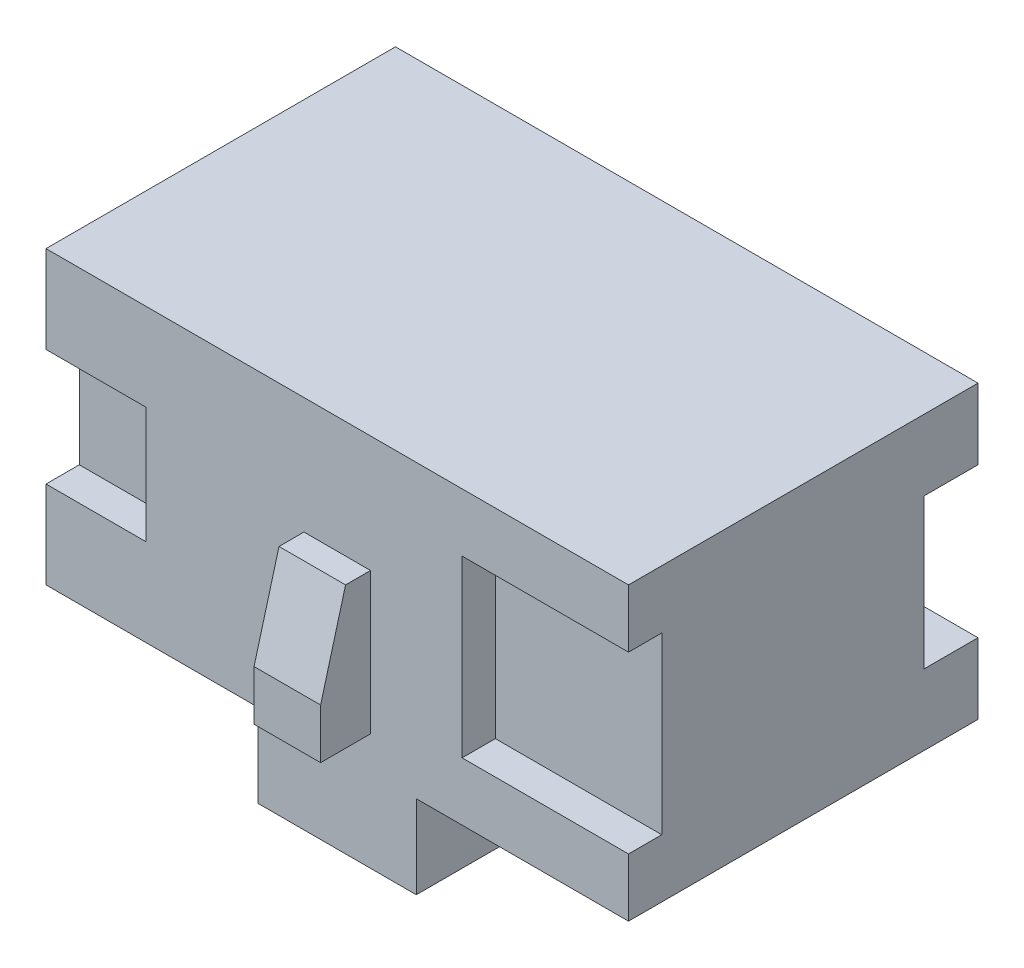
ISO-10303-21;
HEADER;
FILE_DESCRIPTION(('STEP AP214'),'2;1');
FILE_NAME('part.step','',(''),(''),'','','');
FILE_SCHEMA(('AUTOMOTIVE_DESIGN { 1 0 10303 214 1 1 1 1 }'));
ENDSEC;
DATA;
#1=APPLICATION_CONTEXT('core data for automotive mechanical design processes');
#2=APPLICATION_PROTOCOL_DEFINITION('international standard','automotive_design',2000,#1);
#3=PRODUCT_CONTEXT('',#1,'mechanical');
#4=PRODUCT('Part','Part','',(#3));
#5=PRODUCT_RELATED_PRODUCT_CATEGORY('part','',(#4));
#6=PRODUCT_DEFINITION_FORMATION('','',#4);
#7=PRODUCT_DEFINITION_CONTEXT('part definition',#1,'design');
#8=PRODUCT_DEFINITION('design','',#6,#7);
#9=PRODUCT_DEFINITION_SHAPE('','',#8);
#10=(LENGTH_UNIT() NAMED_UNIT(*) SI_UNIT(.MILLI.,.METRE.));
#11=(NAMED_UNIT(*) PLANE_ANGLE_UNIT() SI_UNIT($,.RADIAN.));
#12=(NAMED_UNIT(*) SI_UNIT($,.STERADIAN.) SOLID_ANGLE_UNIT());
#13=UNCERTAINTY_MEASURE_WITH_UNIT(LENGTH_MEASURE(1.E-05),#10,'distance_accuracy_value','');
#14=(GEOMETRIC_REPRESENTATION_CONTEXT(3) GLOBAL_UNCERTAINTY_ASSIGNED_CONTEXT((#13)) GLOBAL_UNIT_ASSIGNED_CONTEXT((#10,
#11,#12)) REPRESENTATION_CONTEXT('',''));
#15=CARTESIAN_POINT('',(0.,0.,0.));
#16=DIRECTION('',(0.,0.,1.));
#17=DIRECTION('',(1.,0.,0.));
#18=AXIS2_PLACEMENT_3D('',#15,#16,#17);
#19=CARTESIAN_POINT('',(0.,0.,42.));
#20=DIRECTION('',(0.,0.,1.));
#21=DIRECTION('',(1.,0.,0.));
#22=AXIS2_PLACEMENT_3D('',#19,#20,#21);
#23=PLANE('',#22);
#24=DIRECTION('',(-1.,0.,0.));
#25=VECTOR('',#24,1.);
#26=CARTESIAN_POINT('',(-23.,7.,42.));
#27=LINE('',#26,#25);
#28=CARTESIAN_POINT('',(-23.,7.,42.));
#29=VERTEX_POINT('',#28);
#30=CARTESIAN_POINT('',(-35.,7.,42.));
#31=VERTEX_POINT('',#30);
#32=EDGE_CURVE('E251',#29,#31,#27,.T.);
#33=ORIENTED_EDGE('',*,*,#32,.F.);
#34=DIRECTION('',(0.,1.,0.));
#35=VECTOR('',#34,1.);
#36=CARTESIAN_POINT('',(-23.,-7.,42.));
#37=LINE('',#36,#35);
#38=CARTESIAN_POINT('',(-23.,-7.,42.));
#39=VERTEX_POINT('',#38);
#40=EDGE_CURVE('E263',#39,#29,#37,.T.);
#41=ORIENTED_EDGE('',*,*,#40,.F.);
#42=DIRECTION('',(1.,0.,0.));
#43=VECTOR('',#42,1.);
#44=CARTESIAN_POINT('',(-23.,-7.,42.));
#45=LINE('',#44,#43);
#46=CARTESIAN_POINT('',(-35.,-7.,42.));
#47=VERTEX_POINT('',#46);
#48=EDGE_CURVE('E242',#47,#39,#45,.T.);
#49=ORIENTED_EDGE('',*,*,#48,.F.);
#50=DIRECTION('',(0.,1.,0.));
#51=VECTOR('',#50,1.);
#52=CARTESIAN_POINT('',(-35.,0.,42.));
#53=LINE('',#52,#51);
#54=CARTESIAN_POINT('',(-35.,-17.5,42.));
#55=VERTEX_POINT('',#54);
#56=EDGE_CURVE('E347',#55,#47,#53,.T.);
#57=ORIENTED_EDGE('',*,*,#56,.F.);
#58=DIRECTION('',(1.,0.,0.));
#59=VECTOR('',#58,1.);
#60=CARTESIAN_POINT('',(0.,-17.5,42.));
#61=LINE('',#60,#59);
#62=CARTESIAN_POINT('',(-9.5,-17.5,42.));
#63=VERTEX_POINT('',#62);
#64=EDGE_CURVE('E339',#55,#63,#61,.T.);
#65=ORIENTED_EDGE('',*,*,#64,.T.);
#66=DIRECTION('',(0.,1.,0.));
#67=VECTOR('',#66,1.);
#68=CARTESIAN_POINT('',(-9.5,0.,42.));
#69=LINE('',#68,#67);
#70=CARTESIAN_POINT('',(-9.5,-27.5,42.));
#71=VERTEX_POINT('',#70);
#72=EDGE_CURVE('E350',#71,#63,#69,.T.);
#73=ORIENTED_EDGE('',*,*,#72,.F.);
#74=DIRECTION('',(1.,0.,0.));
#75=VECTOR('',#74,1.);
#76=CARTESIAN_POINT('',(0.,-27.5,42.));
#77=LINE('',#76,#75);
#78=CARTESIAN_POINT('',(9.5,-27.5,42.));
#79=VERTEX_POINT('',#78);
#80=EDGE_CURVE('E330',#71,#79,#77,.T.);
#81=ORIENTED_EDGE('',*,*,#80,.T.);
#82=DIRECTION('',(0.,1.,0.));
#83=VECTOR('',#82,1.);
#84=CARTESIAN_POINT('',(9.5,0.,42.));
#85=LINE('',#84,#83);
#86=CARTESIAN_POINT('',(9.5,-17.5,42.));
#87=VERTEX_POINT('',#86);
#88=EDGE_CURVE('E333',#79,#87,#85,.T.);
#89=ORIENTED_EDGE('',*,*,#88,.T.);
#90=CARTESIAN_POINT('',(35.,-17.5,42.));
#91=VERTEX_POINT('',#90);
#92=EDGE_CURVE('E336',#87,#91,#61,.T.);
#93=ORIENTED_EDGE('',*,*,#92,.T.);
#94=DIRECTION('',(0.,1.,0.));
#95=VECTOR('',#94,1.);
#96=CARTESIAN_POINT('',(35.,0.,42.));
#97=LINE('',#96,#95);
#98=CARTESIAN_POINT('',(35.,-10.5,42.));
#99=VERTEX_POINT('',#98);
#100=EDGE_CURVE('E340',#91,#99,#97,.T.);
#101=ORIENTED_EDGE('',*,*,#100,.T.);
#102=DIRECTION('',(1.,0.,0.));
#103=VECTOR('',#102,1.);
#104=CARTESIAN_POINT('',(35.,-10.5,42.));
#105=LINE('',#104,#103);
#106=CARTESIAN_POINT('',(15.,-10.5,42.));
#107=VERTEX_POINT('',#106);
#108=EDGE_CURVE('E290',#107,#99,#105,.T.);
#109=ORIENTED_EDGE('',*,*,#108,.F.);
#110=DIRECTION('',(0.,-1.,0.));
#111=VECTOR('',#110,1.);
#112=CARTESIAN_POINT('',(15.,-10.5,42.));
#113=LINE('',#112,#111);
#114=CARTESIAN_POINT('',(15.,10.5,42.));
#115=VERTEX_POINT('',#114);
#116=EDGE_CURVE('E270',#115,#107,#113,.T.);
#117=ORIENTED_EDGE('',*,*,#116,.F.);
#118=DIRECTION('',(-1.,0.,0.));
#119=VECTOR('',#118,1.);
#120=CARTESIAN_POINT('',(35.,10.5,42.));
#121=LINE('',#120,#119);
#122=CARTESIAN_POINT('',(35.,10.5,42.));
#123=VERTEX_POINT('',#122);
#124=EDGE_CURVE('E280',#123,#115,#121,.T.);
#125=ORIENTED_EDGE('',*,*,#124,.F.);
#126=CARTESIAN_POINT('',(35.,17.5,42.));
#127=VERTEX_POINT('',#126);
#128=EDGE_CURVE('E338',#123,#127,#97,.T.);
#129=ORIENTED_EDGE('',*,*,#128,.T.);
#130=DIRECTION('',(1.,0.,0.));
#131=VECTOR('',#130,1.);
#132=CARTESIAN_POINT('',(0.,17.5,42.));
#133=LINE('',#132,#131);
#134=CARTESIAN_POINT('',(-35.,17.5,42.));
#135=VERTEX_POINT('',#134);
#136=EDGE_CURVE('E343',#135,#127,#133,.T.);
#137=ORIENTED_EDGE('',*,*,#136,.F.);
#138=EDGE_CURVE('E346',#31,#135,#53,.T.);
#139=ORIENTED_EDGE('',*,*,#138,.F.);
#140=EDGE_LOOP('',(#33,#41,#49,#57,#65,#73,#81,#89,#93,#101,#109,#117,#125,#129,#137,#139));
#141=FACE_BOUND('',#140,.T.);
#142=DIRECTION('',(1.,0.,0.));
#143=VECTOR('',#142,1.);
#144=CARTESIAN_POINT('',(-4.,-13.5,42.));
#145=LINE('',#144,#143);
#146=CARTESIAN_POINT('',(-4.,-13.5,42.));
#147=VERTEX_POINT('',#146);
#148=CARTESIAN_POINT('',(4.,-13.5,42.));
#149=VERTEX_POINT('',#148);
#150=EDGE_CURVE('E54',#147,#149,#145,.T.);
#151=ORIENTED_EDGE('',*,*,#150,.F.);
#152=DIRECTION('',(0.,1.,0.));
#153=VECTOR('',#152,1.);
#154=CARTESIAN_POINT('',(-4.,0.,42.));
#155=LINE('',#154,#153);
#156=CARTESIAN_POINT('',(-4.,3.5,42.));
#157=VERTEX_POINT('',#156);
#158=EDGE_CURVE('E49',#147,#157,#155,.T.);
#159=ORIENTED_EDGE('',*,*,#158,.T.);
#160=DIRECTION('',(1.,0.,0.));
#161=VECTOR('',#160,1.);
#162=CARTESIAN_POINT('',(-4.,3.5,42.));
#163=LINE('',#162,#161);
#164=CARTESIAN_POINT('',(4.,3.5,42.));
#165=VERTEX_POINT('',#164);
#166=EDGE_CURVE('E240',#157,#165,#163,.T.);
#167=ORIENTED_EDGE('',*,*,#166,.T.);
#168=DIRECTION('',(0.,1.,0.));
#169=VECTOR('',#168,1.);
#170=CARTESIAN_POINT('',(4.,0.,42.));
#171=LINE('',#170,#169);
#172=EDGE_CURVE('E224',#149,#165,#171,.T.);
#173=ORIENTED_EDGE('',*,*,#172,.F.);
#174=EDGE_LOOP('',(#151,#159,#167,#173));
#175=FACE_BOUND('',#174,.T.);
#176=ADVANCED_FACE('F34',(#141,#175),#23,.T.);
#177=CARTESIAN_POINT('',(0.,0.,0.));
#178=DIRECTION('',(0.,0.,1.));
#179=DIRECTION('',(1.,0.,0.));
#180=AXIS2_PLACEMENT_3D('',#177,#178,#179);
#181=PLANE('',#180);
#182=DIRECTION('',(0.,1.,0.));
#183=VECTOR('',#182,1.);
#184=CARTESIAN_POINT('',(-35.,0.,0.));
#185=LINE('',#184,#183);
#186=CARTESIAN_POINT('',(-35.,-17.5,0.));
#187=VERTEX_POINT('',#186);
#188=CARTESIAN_POINT('',(-35.,-9.,0.));
#189=VERTEX_POINT('',#188);
#190=EDGE_CURVE('E369',#187,#189,#185,.T.);
#191=ORIENTED_EDGE('',*,*,#190,.T.);
#192=DIRECTION('',(1.,0.,0.));
#193=VECTOR('',#192,1.);
#194=CARTESIAN_POINT('',(-35.,-9.,0.));
#195=LINE('',#194,#193);
#196=CARTESIAN_POINT('',(35.,-9.,0.));
#197=VERTEX_POINT('',#196);
#198=EDGE_CURVE('E314',#189,#197,#195,.T.);
#199=ORIENTED_EDGE('',*,*,#198,.T.);
#200=DIRECTION('',(0.,1.,0.));
#201=VECTOR('',#200,1.);
#202=CARTESIAN_POINT('',(35.,0.,0.));
#203=LINE('',#202,#201);
#204=CARTESIAN_POINT('',(35.,-17.5,0.));
#205=VERTEX_POINT('',#204);
#206=EDGE_CURVE('E362',#205,#197,#203,.T.);
#207=ORIENTED_EDGE('',*,*,#206,.F.);
#208=DIRECTION('',(1.,0.,0.));
#209=VECTOR('',#208,1.);
#210=CARTESIAN_POINT('',(0.,-17.5,0.));
#211=LINE('',#210,#209);
#212=CARTESIAN_POINT('',(9.5,-17.5,0.));
#213=VERTEX_POINT('',#212);
#214=EDGE_CURVE('E358',#213,#205,#211,.T.);
#215=ORIENTED_EDGE('',*,*,#214,.F.);
#216=DIRECTION('',(0.,1.,0.));
#217=VECTOR('',#216,1.);
#218=CARTESIAN_POINT('',(9.5,0.,0.));
#219=LINE('',#218,#217);
#220=CARTESIAN_POINT('',(9.5,-27.5,0.));
#221=VERTEX_POINT('',#220);
#222=EDGE_CURVE('E356',#221,#213,#219,.T.);
#223=ORIENTED_EDGE('',*,*,#222,.F.);
#224=DIRECTION('',(1.,0.,0.));
#225=VECTOR('',#224,1.);
#226=CARTESIAN_POINT('',(0.,-27.5,0.));
#227=LINE('',#226,#225);
#228=CARTESIAN_POINT('',(-9.5,-27.5,0.));
#229=VERTEX_POINT('',#228);
#230=EDGE_CURVE('E323',#229,#221,#227,.T.);
#231=ORIENTED_EDGE('',*,*,#230,.F.);
#232=DIRECTION('',(0.,1.,0.));
#233=VECTOR('',#232,1.);
#234=CARTESIAN_POINT('',(-9.5,0.,0.));
#235=LINE('',#234,#233);
#236=CARTESIAN_POINT('',(-9.5,-17.5,0.));
#237=VERTEX_POINT('',#236);
#238=EDGE_CURVE('E334',#229,#237,#235,.T.);
#239=ORIENTED_EDGE('',*,*,#238,.T.);
#240=EDGE_CURVE('E361',#187,#237,#211,.T.);
#241=ORIENTED_EDGE('',*,*,#240,.F.);
#242=EDGE_LOOP('',(#191,#199,#207,#215,#223,#231,#239,#241));
#243=FACE_BOUND('',#242,.T.);
#244=ADVANCED_FACE('F397',(#243),#181,.F.);
#245=CARTESIAN_POINT('',(0.,-27.5,42.));
#246=DIRECTION('',(0.,1.,0.));
#247=DIRECTION('',(0.,0.,1.));
#248=AXIS2_PLACEMENT_3D('',#245,#246,#247);
#249=PLANE('',#248);
#250=ORIENTED_EDGE('',*,*,#230,.T.);
#251=DIRECTION('',(0.,0.,-1.));
#252=VECTOR('',#251,1.);
#253=CARTESIAN_POINT('',(9.5,-27.5,42.));
#254=LINE('',#253,#252);
#255=EDGE_CURVE('E11',#79,#221,#254,.T.);
#256=ORIENTED_EDGE('',*,*,#255,.F.);
#257=ORIENTED_EDGE('',*,*,#80,.F.);
#258=DIRECTION('',(0.,0.,-1.));
#259=VECTOR('',#258,1.);
#260=CARTESIAN_POINT('',(-9.5,-27.5,42.));
#261=LINE('',#260,#259);
#262=EDGE_CURVE('E353',#71,#229,#261,.T.);
#263=ORIENTED_EDGE('',*,*,#262,.T.);
#264=EDGE_LOOP('',(#250,#256,#257,#263));
#265=FACE_BOUND('',#264,.T.);
#266=ADVANCED_FACE('F36',(#265),#249,.F.);
#267=CARTESIAN_POINT('',(9.5,0.,42.));
#268=DIRECTION('',(-1.,0.,0.));
#269=DIRECTION('',(0.,0.,1.));
#270=AXIS2_PLACEMENT_3D('',#267,#268,#269);
#271=PLANE('',#270);
#272=ORIENTED_EDGE('',*,*,#222,.T.);
#273=DIRECTION('',(0.,0.,-1.));
#274=VECTOR('',#273,1.);
#275=CARTESIAN_POINT('',(9.5,-17.5,42.));
#276=LINE('',#275,#274);
#277=EDGE_CURVE('E42',#87,#213,#276,.T.);
#278=ORIENTED_EDGE('',*,*,#277,.F.);
#279=ORIENTED_EDGE('',*,*,#88,.F.);
#280=ORIENTED_EDGE('',*,*,#255,.T.);
#281=EDGE_LOOP('',(#272,#278,#279,#280));
#282=FACE_BOUND('',#281,.T.);
#283=ADVANCED_FACE('F413',(#282),#271,.F.);
#284=CARTESIAN_POINT('',(0.,-17.5,42.));
#285=DIRECTION('',(0.,1.,0.));
#286=DIRECTION('',(0.,0.,1.));
#287=AXIS2_PLACEMENT_3D('',#284,#285,#286);
#288=PLANE('',#287);
#289=ORIENTED_EDGE('',*,*,#214,.T.);
#290=DIRECTION('',(0.,0.,-1.));
#291=VECTOR('',#290,1.);
#292=CARTESIAN_POINT('',(35.,-17.5,42.));
#293=LINE('',#292,#291);
#294=EDGE_CURVE('E385',#91,#205,#293,.T.);
#295=ORIENTED_EDGE('',*,*,#294,.F.);
#296=ORIENTED_EDGE('',*,*,#92,.F.);
#297=ORIENTED_EDGE('',*,*,#277,.T.);
#298=EDGE_LOOP('',(#289,#295,#296,#297));
#299=FACE_BOUND('',#298,.T.);
#300=ADVANCED_FACE('F392',(#299),#288,.F.);
#301=CARTESIAN_POINT('',(35.,0.,42.));
#302=DIRECTION('',(-1.,0.,0.));
#303=DIRECTION('',(0.,0.,1.));
#304=AXIS2_PLACEMENT_3D('',#301,#302,#303);
#305=PLANE('',#304);
#306=ORIENTED_EDGE('',*,*,#128,.F.);
#307=DIRECTION('',(0.,0.,1.));
#308=VECTOR('',#307,1.);
#309=CARTESIAN_POINT('',(35.,10.5,38.));
#310=LINE('',#309,#308);
#311=CARTESIAN_POINT('',(35.,10.5,38.));
#312=VERTEX_POINT('',#311);
#313=EDGE_CURVE('E297',#312,#123,#310,.T.);
#314=ORIENTED_EDGE('',*,*,#313,.F.);
#315=DIRECTION('',(0.,1.,0.));
#316=VECTOR('',#315,1.);
#317=CARTESIAN_POINT('',(35.,-10.5,38.));
#318=LINE('',#317,#316);
#319=CARTESIAN_POINT('',(35.,-10.5,38.));
#320=VERTEX_POINT('',#319);
#321=EDGE_CURVE('E283',#320,#312,#318,.T.);
#322=ORIENTED_EDGE('',*,*,#321,.F.);
#323=DIRECTION('',(0.,0.,1.));
#324=VECTOR('',#323,1.);
#325=CARTESIAN_POINT('',(35.,-10.5,38.));
#326=LINE('',#325,#324);
#327=EDGE_CURVE('E299',#320,#99,#326,.T.);
#328=ORIENTED_EDGE('',*,*,#327,.T.);
#329=ORIENTED_EDGE('',*,*,#100,.F.);
#330=ORIENTED_EDGE('',*,*,#294,.T.);
#331=ORIENTED_EDGE('',*,*,#206,.T.);
#332=DIRECTION('',(0.,0.,-1.));
#333=VECTOR('',#332,1.);
#334=CARTESIAN_POINT('',(35.,-9.,6.5));
#335=LINE('',#334,#333);
#336=CARTESIAN_POINT('',(35.,-9.,6.5));
#337=VERTEX_POINT('',#336);
#338=EDGE_CURVE('E296',#337,#197,#335,.T.);
#339=ORIENTED_EDGE('',*,*,#338,.F.);
#340=DIRECTION('',(0.,-1.,0.));
#341=VECTOR('',#340,1.);
#342=CARTESIAN_POINT('',(35.,9.,6.5));
#343=LINE('',#342,#341);
#344=CARTESIAN_POINT('',(35.,9.,6.5));
#345=VERTEX_POINT('',#344);
#346=EDGE_CURVE('E308',#345,#337,#343,.T.);
#347=ORIENTED_EDGE('',*,*,#346,.F.);
#348=DIRECTION('',(0.,0.,1.));
#349=VECTOR('',#348,1.);
#350=CARTESIAN_POINT('',(35.,9.,6.5));
#351=LINE('',#350,#349);
#352=CARTESIAN_POINT('',(35.,9.,0.));
#353=VERTEX_POINT('',#352);
#354=EDGE_CURVE('E316',#353,#345,#351,.T.);
#355=ORIENTED_EDGE('',*,*,#354,.F.);
#356=CARTESIAN_POINT('',(35.,17.5,0.));
#357=VERTEX_POINT('',#356);
#358=EDGE_CURVE('E360',#353,#357,#203,.T.);
#359=ORIENTED_EDGE('',*,*,#358,.T.);
#360=DIRECTION('',(0.,0.,-1.));
#361=VECTOR('',#360,1.);
#362=CARTESIAN_POINT('',(35.,17.5,42.));
#363=LINE('',#362,#361);
#364=EDGE_CURVE('E382',#127,#357,#363,.T.);
#365=ORIENTED_EDGE('',*,*,#364,.F.);
#366=EDGE_LOOP('',(#306,#314,#322,#328,#329,#330,#331,#339,#347,#355,#359,#365));
#367=FACE_BOUND('',#366,.T.);
#368=ADVANCED_FACE('F402',(#367),#305,.F.);
#369=CARTESIAN_POINT('',(0.,17.5,42.));
#370=DIRECTION('',(0.,1.,0.));
#371=DIRECTION('',(0.,0.,1.));
#372=AXIS2_PLACEMENT_3D('',#369,#370,#371);
#373=PLANE('',#372);
#374=DIRECTION('',(1.,0.,0.));
#375=VECTOR('',#374,1.);
#376=CARTESIAN_POINT('',(0.,17.5,0.));
#377=LINE('',#376,#375);
#378=CARTESIAN_POINT('',(-35.,17.5,0.));
#379=VERTEX_POINT('',#378);
#380=EDGE_CURVE('E365',#379,#357,#377,.T.);
#381=ORIENTED_EDGE('',*,*,#380,.F.);
#382=DIRECTION('',(0.,0.,-1.));
#383=VECTOR('',#382,1.);
#384=CARTESIAN_POINT('',(-35.,17.5,42.));
#385=LINE('',#384,#383);
#386=EDGE_CURVE('E379',#135,#379,#385,.T.);
#387=ORIENTED_EDGE('',*,*,#386,.F.);
#388=ORIENTED_EDGE('',*,*,#136,.T.);
#389=ORIENTED_EDGE('',*,*,#364,.T.);
#390=EDGE_LOOP('',(#381,#387,#388,#389));
#391=FACE_BOUND('',#390,.T.);
#392=ADVANCED_FACE('F444',(#391),#373,.T.);
#393=CARTESIAN_POINT('',(-35.,0.,42.));
#394=DIRECTION('',(-1.,0.,0.));
#395=DIRECTION('',(0.,0.,1.));
#396=AXIS2_PLACEMENT_3D('',#393,#394,#395);
#397=PLANE('',#396);
#398=DIRECTION('',(0.,0.,1.));
#399=VECTOR('',#398,1.);
#400=CARTESIAN_POINT('',(-35.,7.,38.));
#401=LINE('',#400,#399);
#402=CARTESIAN_POINT('',(-35.,7.,38.));
#403=VERTEX_POINT('',#402);
#404=EDGE_CURVE('E267',#403,#31,#401,.T.);
#405=ORIENTED_EDGE('',*,*,#404,.T.);
#406=ORIENTED_EDGE('',*,*,#138,.T.);
#407=ORIENTED_EDGE('',*,*,#386,.T.);
#408=CARTESIAN_POINT('',(-35.,9.,0.));
#409=VERTEX_POINT('',#408);
#410=EDGE_CURVE('E368',#409,#379,#185,.T.);
#411=ORIENTED_EDGE('',*,*,#410,.F.);
#412=DIRECTION('',(0.,0.,1.));
#413=VECTOR('',#412,1.);
#414=CARTESIAN_POINT('',(-35.,9.,6.5));
#415=LINE('',#414,#413);
#416=CARTESIAN_POINT('',(-35.,9.,6.5));
#417=VERTEX_POINT('',#416);
#418=EDGE_CURVE('E307',#409,#417,#415,.T.);
#419=ORIENTED_EDGE('',*,*,#418,.T.);
#420=DIRECTION('',(0.,-1.,0.));
#421=VECTOR('',#420,1.);
#422=CARTESIAN_POINT('',(-35.,9.,6.5));
#423=LINE('',#422,#421);
#424=CARTESIAN_POINT('',(-35.,-9.,6.5));
#425=VERTEX_POINT('',#424);
#426=EDGE_CURVE('E311',#417,#425,#423,.T.);
#427=ORIENTED_EDGE('',*,*,#426,.T.);
#428=DIRECTION('',(0.,0.,-1.));
#429=VECTOR('',#428,1.);
#430=CARTESIAN_POINT('',(-35.,-9.,6.5));
#431=LINE('',#430,#429);
#432=EDGE_CURVE('E304',#425,#189,#431,.T.);
#433=ORIENTED_EDGE('',*,*,#432,.T.);
#434=ORIENTED_EDGE('',*,*,#190,.F.);
#435=DIRECTION('',(0.,0.,-1.));
#436=VECTOR('',#435,1.);
#437=CARTESIAN_POINT('',(-35.,-17.5,42.));
#438=LINE('',#437,#436);
#439=EDGE_CURVE('E377',#55,#187,#438,.T.);
#440=ORIENTED_EDGE('',*,*,#439,.F.);
#441=ORIENTED_EDGE('',*,*,#56,.T.);
#442=DIRECTION('',(0.,0.,1.));
#443=VECTOR('',#442,1.);
#444=CARTESIAN_POINT('',(-35.,-7.,38.));
#445=LINE('',#444,#443);
#446=CARTESIAN_POINT('',(-35.,-7.,38.));
#447=VERTEX_POINT('',#446);
#448=EDGE_CURVE('E260',#447,#47,#445,.T.);
#449=ORIENTED_EDGE('',*,*,#448,.F.);
#450=DIRECTION('',(0.,-1.,0.));
#451=VECTOR('',#450,1.);
#452=CARTESIAN_POINT('',(-35.,-7.,38.));
#453=LINE('',#452,#451);
#454=EDGE_CURVE('E247',#403,#447,#453,.T.);
#455=ORIENTED_EDGE('',*,*,#454,.F.);
#456=EDGE_LOOP('',(#405,#406,#407,#411,#419,#427,#433,#434,#440,#441,#449,#455));
#457=FACE_BOUND('',#456,.T.);
#458=ADVANCED_FACE('F426',(#457),#397,.T.);
#459=ORIENTED_EDGE('',*,*,#240,.T.);
#460=DIRECTION('',(0.,0.,-1.));
#461=VECTOR('',#460,1.);
#462=CARTESIAN_POINT('',(-9.5,-17.5,42.));
#463=LINE('',#462,#461);
#464=EDGE_CURVE('E375',#63,#237,#463,.T.);
#465=ORIENTED_EDGE('',*,*,#464,.F.);
#466=ORIENTED_EDGE('',*,*,#64,.F.);
#467=ORIENTED_EDGE('',*,*,#439,.T.);
#468=EDGE_LOOP('',(#459,#465,#466,#467));
#469=FACE_BOUND('',#468,.T.);
#470=ADVANCED_FACE('F423',(#469),#288,.F.);
#471=CARTESIAN_POINT('',(-9.5,0.,42.));
#472=DIRECTION('',(-1.,0.,0.));
#473=DIRECTION('',(0.,0.,1.));
#474=AXIS2_PLACEMENT_3D('',#471,#472,#473);
#475=PLANE('',#474);
#476=ORIENTED_EDGE('',*,*,#238,.F.);
#477=ORIENTED_EDGE('',*,*,#262,.F.);
#478=ORIENTED_EDGE('',*,*,#72,.T.);
#479=ORIENTED_EDGE('',*,*,#464,.T.);
#480=EDGE_LOOP('',(#476,#477,#478,#479));
#481=FACE_BOUND('',#480,.T.);
#482=ADVANCED_FACE('F418',(#481),#475,.T.);
#483=ORIENTED_EDGE('',*,*,#358,.F.);
#484=DIRECTION('',(1.,0.,0.));
#485=VECTOR('',#484,1.);
#486=CARTESIAN_POINT('',(-35.,9.,0.));
#487=LINE('',#486,#485);
#488=EDGE_CURVE('E326',#409,#353,#487,.T.);
#489=ORIENTED_EDGE('',*,*,#488,.F.);
#490=ORIENTED_EDGE('',*,*,#410,.T.);
#491=ORIENTED_EDGE('',*,*,#380,.T.);
#492=EDGE_LOOP('',(#483,#489,#490,#491));
#493=FACE_BOUND('',#492,.T.);
#494=ADVANCED_FACE('F439',(#493),#181,.F.);
#495=CARTESIAN_POINT('',(-35.,-9.,6.5));
#496=DIRECTION('',(0.,-1.,0.));
#497=DIRECTION('',(0.,0.,-1.));
#498=AXIS2_PLACEMENT_3D('',#495,#496,#497);
#499=PLANE('',#498);
#500=ORIENTED_EDGE('',*,*,#338,.T.);
#501=ORIENTED_EDGE('',*,*,#198,.F.);
#502=ORIENTED_EDGE('',*,*,#432,.F.);
#503=DIRECTION('',(1.,0.,0.));
#504=VECTOR('',#503,1.);
#505=CARTESIAN_POINT('',(-35.,-9.,6.5));
#506=LINE('',#505,#504);
#507=EDGE_CURVE('E321',#425,#337,#506,.T.);
#508=ORIENTED_EDGE('',*,*,#507,.T.);
#509=EDGE_LOOP('',(#500,#501,#502,#508));
#510=FACE_BOUND('',#509,.T.);
#511=ADVANCED_FACE('F430',(#510),#499,.F.);
#512=CARTESIAN_POINT('',(-35.,9.,6.5));
#513=DIRECTION('',(0.,0.,1.));
#514=DIRECTION('',(0.,-1.,0.));
#515=AXIS2_PLACEMENT_3D('',#512,#513,#514);
#516=PLANE('',#515);
#517=ORIENTED_EDGE('',*,*,#346,.T.);
#518=ORIENTED_EDGE('',*,*,#507,.F.);
#519=ORIENTED_EDGE('',*,*,#426,.F.);
#520=DIRECTION('',(1.,0.,0.));
#521=VECTOR('',#520,1.);
#522=CARTESIAN_POINT('',(-35.,9.,6.5));
#523=LINE('',#522,#521);
#524=EDGE_CURVE('E324',#417,#345,#523,.T.);
#525=ORIENTED_EDGE('',*,*,#524,.T.);
#526=EDGE_LOOP('',(#517,#518,#519,#525));
#527=FACE_BOUND('',#526,.T.);
#528=ADVANCED_FACE('F432',(#527),#516,.F.);
#529=CARTESIAN_POINT('',(-35.,9.,6.5));
#530=DIRECTION('',(0.,1.,0.));
#531=DIRECTION('',(0.,0.,1.));
#532=AXIS2_PLACEMENT_3D('',#529,#530,#531);
#533=PLANE('',#532);
#534=ORIENTED_EDGE('',*,*,#354,.T.);
#535=ORIENTED_EDGE('',*,*,#524,.F.);
#536=ORIENTED_EDGE('',*,*,#418,.F.);
#537=ORIENTED_EDGE('',*,*,#488,.T.);
#538=EDGE_LOOP('',(#534,#535,#536,#537));
#539=FACE_BOUND('',#538,.T.);
#540=ADVANCED_FACE('F461',(#539),#533,.F.);
#541=CARTESIAN_POINT('',(15.,-10.5,38.));
#542=DIRECTION('',(-1.,0.,0.));
#543=DIRECTION('',(0.,0.,1.));
#544=AXIS2_PLACEMENT_3D('',#541,#542,#543);
#545=PLANE('',#544);
#546=ORIENTED_EDGE('',*,*,#116,.T.);
#547=DIRECTION('',(0.,0.,1.));
#548=VECTOR('',#547,1.);
#549=CARTESIAN_POINT('',(15.,-10.5,38.));
#550=LINE('',#549,#548);
#551=CARTESIAN_POINT('',(15.,-10.5,38.));
#552=VERTEX_POINT('',#551);
#553=EDGE_CURVE('E288',#552,#107,#550,.T.);
#554=ORIENTED_EDGE('',*,*,#553,.F.);
#555=DIRECTION('',(0.,-1.,0.));
#556=VECTOR('',#555,1.);
#557=CARTESIAN_POINT('',(15.,-10.5,38.));
#558=LINE('',#557,#556);
#559=CARTESIAN_POINT('',(15.,10.5,38.));
#560=VERTEX_POINT('',#559);
#561=EDGE_CURVE('E276',#560,#552,#558,.T.);
#562=ORIENTED_EDGE('',*,*,#561,.F.);
#563=DIRECTION('',(0.,0.,1.));
#564=VECTOR('',#563,1.);
#565=CARTESIAN_POINT('',(15.,10.5,38.));
#566=LINE('',#565,#564);
#567=EDGE_CURVE('E294',#560,#115,#566,.T.);
#568=ORIENTED_EDGE('',*,*,#567,.T.);
#569=EDGE_LOOP('',(#546,#554,#562,#568));
#570=FACE_BOUND('',#569,.T.);
#571=ADVANCED_FACE('F459',(#570),#545,.F.);
#572=CARTESIAN_POINT('',(35.,10.5,38.));
#573=DIRECTION('',(0.,1.,0.));
#574=DIRECTION('',(-1.,0.,0.));
#575=AXIS2_PLACEMENT_3D('',#572,#573,#574);
#576=PLANE('',#575);
#577=ORIENTED_EDGE('',*,*,#124,.T.);
#578=ORIENTED_EDGE('',*,*,#567,.F.);
#579=DIRECTION('',(-1.,0.,0.));
#580=VECTOR('',#579,1.);
#581=CARTESIAN_POINT('',(35.,10.5,38.));
#582=LINE('',#581,#580);
#583=EDGE_CURVE('E285',#312,#560,#582,.T.);
#584=ORIENTED_EDGE('',*,*,#583,.F.);
#585=ORIENTED_EDGE('',*,*,#313,.T.);
#586=EDGE_LOOP('',(#577,#578,#584,#585));
#587=FACE_BOUND('',#586,.T.);
#588=ADVANCED_FACE('F450',(#587),#576,.F.);
#589=CARTESIAN_POINT('',(35.,-10.5,38.));
#590=DIRECTION('',(0.,-1.,0.));
#591=DIRECTION('',(1.,0.,0.));
#592=AXIS2_PLACEMENT_3D('',#589,#590,#591);
#593=PLANE('',#592);
#594=ORIENTED_EDGE('',*,*,#108,.T.);
#595=ORIENTED_EDGE('',*,*,#327,.F.);
#596=DIRECTION('',(1.,0.,0.));
#597=VECTOR('',#596,1.);
#598=CARTESIAN_POINT('',(35.,-10.5,38.));
#599=LINE('',#598,#597);
#600=EDGE_CURVE('E279',#552,#320,#599,.T.);
#601=ORIENTED_EDGE('',*,*,#600,.F.);
#602=ORIENTED_EDGE('',*,*,#553,.T.);
#603=EDGE_LOOP('',(#594,#595,#601,#602));
#604=FACE_BOUND('',#603,.T.);
#605=ADVANCED_FACE('F457',(#604),#593,.F.);
#606=CARTESIAN_POINT('',(0.,0.,38.));
#607=DIRECTION('',(0.,0.,1.));
#608=DIRECTION('',(1.,0.,0.));
#609=AXIS2_PLACEMENT_3D('',#606,#607,#608);
#610=PLANE('',#609);
#611=ORIENTED_EDGE('',*,*,#561,.T.);
#612=ORIENTED_EDGE('',*,*,#600,.T.);
#613=ORIENTED_EDGE('',*,*,#321,.T.);
#614=ORIENTED_EDGE('',*,*,#583,.T.);
#615=EDGE_LOOP('',(#611,#612,#613,#614));
#616=FACE_BOUND('',#615,.T.);
#617=ADVANCED_FACE('F454',(#616),#610,.T.);
#618=CARTESIAN_POINT('',(-23.,7.,38.));
#619=DIRECTION('',(0.,1.,0.));
#620=DIRECTION('',(-1.,0.,0.));
#621=AXIS2_PLACEMENT_3D('',#618,#619,#620);
#622=PLANE('',#621);
#623=ORIENTED_EDGE('',*,*,#32,.T.);
#624=ORIENTED_EDGE('',*,*,#404,.F.);
#625=DIRECTION('',(-1.,0.,0.));
#626=VECTOR('',#625,1.);
#627=CARTESIAN_POINT('',(-23.,7.,38.));
#628=LINE('',#627,#626);
#629=CARTESIAN_POINT('',(-23.,7.,38.));
#630=VERTEX_POINT('',#629);
#631=EDGE_CURVE('E257',#630,#403,#628,.T.);
#632=ORIENTED_EDGE('',*,*,#631,.F.);
#633=DIRECTION('',(0.,0.,1.));
#634=VECTOR('',#633,1.);
#635=CARTESIAN_POINT('',(-23.,7.,38.));
#636=LINE('',#635,#634);
#637=EDGE_CURVE('E271',#630,#29,#636,.T.);
#638=ORIENTED_EDGE('',*,*,#637,.T.);
#639=EDGE_LOOP('',(#623,#624,#632,#638));
#640=FACE_BOUND('',#639,.T.);
#641=ADVANCED_FACE('F573',(#640),#622,.F.);
#642=CARTESIAN_POINT('',(-23.,-7.,38.));
#643=DIRECTION('',(1.,0.,0.));
#644=DIRECTION('',(0.,0.,-1.));
#645=AXIS2_PLACEMENT_3D('',#642,#643,#644);
#646=PLANE('',#645);
#647=ORIENTED_EDGE('',*,*,#40,.T.);
#648=ORIENTED_EDGE('',*,*,#637,.F.);
#649=DIRECTION('',(0.,1.,0.));
#650=VECTOR('',#649,1.);
#651=CARTESIAN_POINT('',(-23.,-7.,38.));
#652=LINE('',#651,#650);
#653=CARTESIAN_POINT('',(-23.,-7.,38.));
#654=VERTEX_POINT('',#653);
#655=EDGE_CURVE('E254',#654,#630,#652,.T.);
#656=ORIENTED_EDGE('',*,*,#655,.F.);
#657=DIRECTION('',(0.,0.,1.));
#658=VECTOR('',#657,1.);
#659=CARTESIAN_POINT('',(-23.,-7.,38.));
#660=LINE('',#659,#658);
#661=EDGE_CURVE('E273',#654,#39,#660,.T.);
#662=ORIENTED_EDGE('',*,*,#661,.T.);
#663=EDGE_LOOP('',(#647,#648,#656,#662));
#664=FACE_BOUND('',#663,.T.);
#665=ADVANCED_FACE('F582',(#664),#646,.F.);
#666=CARTESIAN_POINT('',(-23.,-7.,38.));
#667=DIRECTION('',(0.,-1.,0.));
#668=DIRECTION('',(1.,0.,0.));
#669=AXIS2_PLACEMENT_3D('',#666,#667,#668);
#670=PLANE('',#669);
#671=ORIENTED_EDGE('',*,*,#48,.T.);
#672=ORIENTED_EDGE('',*,*,#661,.F.);
#673=DIRECTION('',(1.,0.,0.));
#674=VECTOR('',#673,1.);
#675=CARTESIAN_POINT('',(-23.,-7.,38.));
#676=LINE('',#675,#674);
#677=EDGE_CURVE('E250',#447,#654,#676,.T.);
#678=ORIENTED_EDGE('',*,*,#677,.F.);
#679=ORIENTED_EDGE('',*,*,#448,.T.);
#680=EDGE_LOOP('',(#671,#672,#678,#679));
#681=FACE_BOUND('',#680,.T.);
#682=ADVANCED_FACE('F592',(#681),#670,.F.);
#683=CARTESIAN_POINT('',(0.,0.,38.));
#684=DIRECTION('',(0.,0.,1.));
#685=DIRECTION('',(1.,0.,0.));
#686=AXIS2_PLACEMENT_3D('',#683,#684,#685);
#687=PLANE('',#686);
#688=ORIENTED_EDGE('',*,*,#454,.T.);
#689=ORIENTED_EDGE('',*,*,#677,.T.);
#690=ORIENTED_EDGE('',*,*,#655,.T.);
#691=ORIENTED_EDGE('',*,*,#631,.T.);
#692=EDGE_LOOP('',(#688,#689,#690,#691));
#693=FACE_BOUND('',#692,.T.);
#694=ADVANCED_FACE('F602',(#693),#687,.T.);
#695=CARTESIAN_POINT('',(-4.,3.50000000000001,0.));
#696=DIRECTION('',(0.,1.,0.));
#697=DIRECTION('',(0.,0.,1.));
#698=AXIS2_PLACEMENT_3D('',#695,#696,#697);
#699=PLANE('',#698);
#700=DIRECTION('',(1.,0.,0.));
#701=VECTOR('',#700,1.);
#702=CARTESIAN_POINT('',(-4.,3.5,45.));
#703=LINE('',#702,#701);
#704=CARTESIAN_POINT('',(-4.,3.5,45.));
#705=VERTEX_POINT('',#704);
#706=CARTESIAN_POINT('',(4.,3.5,45.));
#707=VERTEX_POINT('',#706);
#708=EDGE_CURVE('E200',#705,#707,#703,.T.);
#709=ORIENTED_EDGE('',*,*,#708,.T.);
#710=DIRECTION('',(0.,0.,1.));
#711=VECTOR('',#710,1.);
#712=CARTESIAN_POINT('',(4.,3.50000000000001,0.));
#713=LINE('',#712,#711);
#714=EDGE_CURVE('E204',#165,#707,#713,.T.);
#715=ORIENTED_EDGE('',*,*,#714,.F.);
#716=ORIENTED_EDGE('',*,*,#166,.F.);
#717=DIRECTION('',(0.,0.,1.));
#718=VECTOR('',#717,1.);
#719=CARTESIAN_POINT('',(-4.,3.50000000000001,0.));
#720=LINE('',#719,#718);
#721=EDGE_CURVE('E206',#157,#705,#720,.T.);
#722=ORIENTED_EDGE('',*,*,#721,.T.);
#723=EDGE_LOOP('',(#709,#715,#716,#722));
#724=FACE_BOUND('',#723,.T.);
#725=ADVANCED_FACE('F202',(#724),#699,.T.);
#726=CARTESIAN_POINT('',(-4.,-13.5,0.));
#727=DIRECTION('',(0.,1.,0.));
#728=DIRECTION('',(0.,0.,1.));
#729=AXIS2_PLACEMENT_3D('',#726,#727,#728);
#730=PLANE('',#729);
#731=ORIENTED_EDGE('',*,*,#150,.T.);
#732=DIRECTION('',(0.,0.,1.));
#733=VECTOR('',#732,1.);
#734=CARTESIAN_POINT('',(4.,-13.5,0.));
#735=LINE('',#734,#733);
#736=CARTESIAN_POINT('',(4.,-13.5,48.));
#737=VERTEX_POINT('',#736);
#738=EDGE_CURVE('E228',#149,#737,#735,.T.);
#739=ORIENTED_EDGE('',*,*,#738,.T.);
#740=DIRECTION('',(1.,0.,0.));
#741=VECTOR('',#740,1.);
#742=CARTESIAN_POINT('',(-4.,-13.5,48.));
#743=LINE('',#742,#741);
#744=CARTESIAN_POINT('',(-4.,-13.5,48.));
#745=VERTEX_POINT('',#744);
#746=EDGE_CURVE('E244',#745,#737,#743,.T.);
#747=ORIENTED_EDGE('',*,*,#746,.F.);
#748=DIRECTION('',(0.,0.,1.));
#749=VECTOR('',#748,1.);
#750=CARTESIAN_POINT('',(-4.,-13.5,0.));
#751=LINE('',#750,#749);
#752=EDGE_CURVE('E237',#147,#745,#751,.T.);
#753=ORIENTED_EDGE('',*,*,#752,.F.);
#754=EDGE_LOOP('',(#731,#739,#747,#753));
#755=FACE_BOUND('',#754,.T.);
#756=ADVANCED_FACE('F626',(#755),#730,.F.);
#757=CARTESIAN_POINT('',(-4.,0.,48.));
#758=DIRECTION('',(0.,0.,-1.));
#759=DIRECTION('',(-1.,0.,0.));
#760=AXIS2_PLACEMENT_3D('',#757,#758,#759);
#761=PLANE('',#760);
#762=ORIENTED_EDGE('',*,*,#746,.T.);
#763=DIRECTION('',(0.,1.,0.));
#764=VECTOR('',#763,1.);
#765=CARTESIAN_POINT('',(4.,0.,48.));
#766=LINE('',#765,#764);
#767=CARTESIAN_POINT('',(4.,-7.49999999999997,48.));
#768=VERTEX_POINT('',#767);
#769=EDGE_CURVE('E219',#737,#768,#766,.T.);
#770=ORIENTED_EDGE('',*,*,#769,.T.);
#771=DIRECTION('',(1.,0.,0.));
#772=VECTOR('',#771,1.);
#773=CARTESIAN_POINT('',(-4.,-7.49999999999997,48.));
#774=LINE('',#773,#772);
#775=CARTESIAN_POINT('',(-4.,-7.49999999999997,48.));
#776=VERTEX_POINT('',#775);
#777=EDGE_CURVE('E210',#776,#768,#774,.T.);
#778=ORIENTED_EDGE('',*,*,#777,.F.);
#779=DIRECTION('',(0.,1.,0.));
#780=VECTOR('',#779,1.);
#781=CARTESIAN_POINT('',(-4.,0.,48.));
#782=LINE('',#781,#780);
#783=EDGE_CURVE('E235',#745,#776,#782,.T.);
#784=ORIENTED_EDGE('',*,*,#783,.F.);
#785=EDGE_LOOP('',(#762,#770,#778,#784));
#786=FACE_BOUND('',#785,.T.);
#787=ADVANCED_FACE('F635',(#786),#761,.F.);
#788=CARTESIAN_POINT('',(-4.,11.6653846153846,42.7730769230769));
#789=DIRECTION('',(0.,0.263117405792109,0.964763821237732));
#790=DIRECTION('',(0.,-0.964763821237732,0.263117405792109));
#791=AXIS2_PLACEMENT_3D('',#788,#789,#790);
#792=PLANE('',#791);
#793=ORIENTED_EDGE('',*,*,#777,.T.);
#794=DIRECTION('',(0.,-0.964763821237732,0.263117405792109));
#795=VECTOR('',#794,1.);
#796=CARTESIAN_POINT('',(4.,11.6653846153846,42.7730769230769));
#797=LINE('',#796,#795);
#798=EDGE_CURVE('E213',#707,#768,#797,.T.);
#799=ORIENTED_EDGE('',*,*,#798,.F.);
#800=ORIENTED_EDGE('',*,*,#708,.F.);
#801=DIRECTION('',(0.,-0.964763821237732,0.263117405792109));
#802=VECTOR('',#801,1.);
#803=CARTESIAN_POINT('',(-4.,11.6653846153846,42.7730769230769));
#804=LINE('',#803,#802);
#805=EDGE_CURVE('E233',#705,#776,#804,.T.);
#806=ORIENTED_EDGE('',*,*,#805,.T.);
#807=EDGE_LOOP('',(#793,#799,#800,#806));
#808=FACE_BOUND('',#807,.T.);
#809=ADVANCED_FACE('F214',(#808),#792,.T.);
#810=CARTESIAN_POINT('',(-4.,0.,0.));
#811=DIRECTION('',(1.,0.,0.));
#812=DIRECTION('',(0.,0.,-1.));
#813=AXIS2_PLACEMENT_3D('',#810,#811,#812);
#814=PLANE('',#813);
#815=ORIENTED_EDGE('',*,*,#721,.F.);
#816=ORIENTED_EDGE('',*,*,#158,.F.);
#817=ORIENTED_EDGE('',*,*,#752,.T.);
#818=ORIENTED_EDGE('',*,*,#783,.T.);
#819=ORIENTED_EDGE('',*,*,#805,.F.);
#820=EDGE_LOOP('',(#815,#816,#817,#818,#819));
#821=FACE_BOUND('',#820,.T.);
#822=ADVANCED_FACE('F654',(#821),#814,.F.);
#823=CARTESIAN_POINT('',(4.,0.,0.));
#824=DIRECTION('',(1.,0.,0.));
#825=DIRECTION('',(0.,0.,-1.));
#826=AXIS2_PLACEMENT_3D('',#823,#824,#825);
#827=PLANE('',#826);
#828=ORIENTED_EDGE('',*,*,#714,.T.);
#829=ORIENTED_EDGE('',*,*,#798,.T.);
#830=ORIENTED_EDGE('',*,*,#769,.F.);
#831=ORIENTED_EDGE('',*,*,#738,.F.);
#832=ORIENTED_EDGE('',*,*,#172,.T.);
#833=EDGE_LOOP('',(#828,#829,#830,#831,#832));
#834=FACE_BOUND('',#833,.T.);
#835=ADVANCED_FACE('F222',(#834),#827,.T.);
#836=CLOSED_SHELL('',(#176,#244,#266,#283,#300,#368,#392,#458,#470,#482,#494,#511,#528,#540,
#571,#588,#605,#617,#641,#665,#682,#694,#725,#756,#787,#809,#822,#835));
#837=MANIFOLD_SOLID_BREP('B2',#836);
#838=ADVANCED_BREP_SHAPE_REPRESENTATION('',(#18,#837),#14);
#839=SHAPE_DEFINITION_REPRESENTATION(#9,#838);
ENDSEC;
END-ISO-10303-21;
